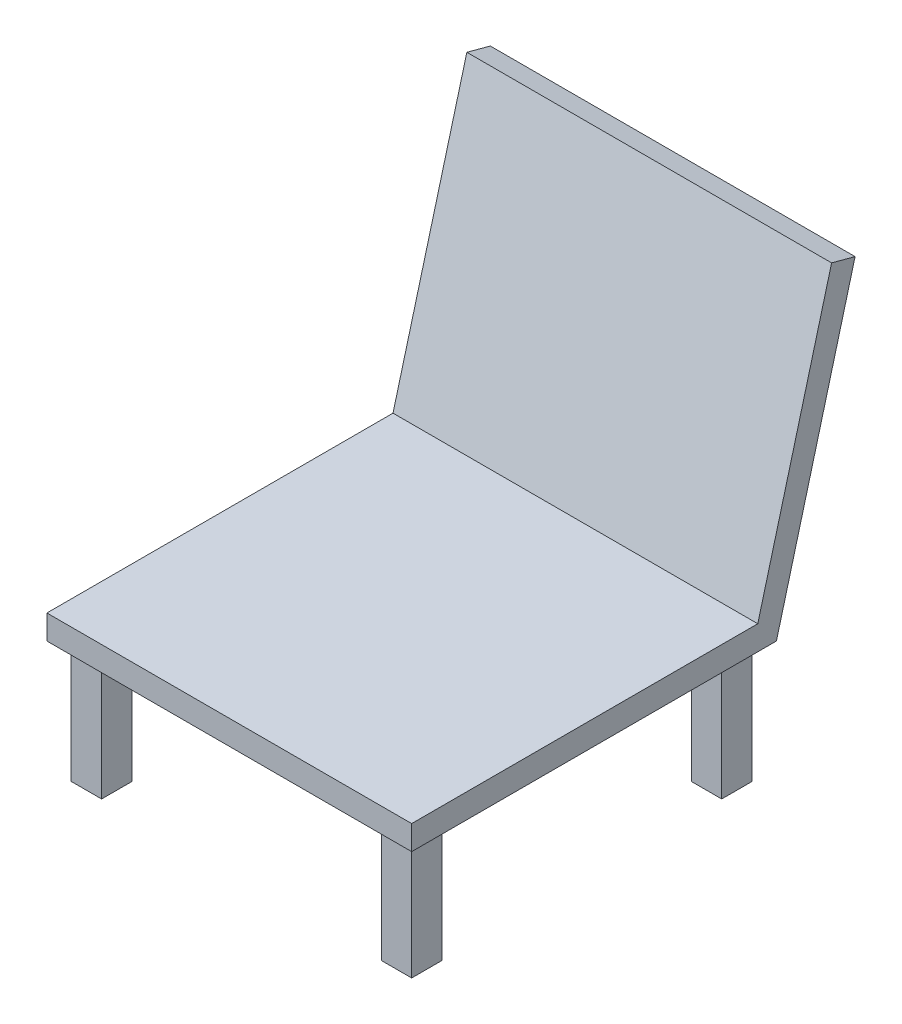
ISO-10303-21;
HEADER;
FILE_DESCRIPTION(('STEP AP214'),'2;1');
FILE_NAME('part.step','',(''),(''),'','','');
FILE_SCHEMA(('AUTOMOTIVE_DESIGN { 1 0 10303 214 1 1 1 1 }'));
ENDSEC;
DATA;
#1=APPLICATION_CONTEXT('core data for automotive mechanical design processes');
#2=APPLICATION_PROTOCOL_DEFINITION('international standard','automotive_design',2000,#1);
#3=PRODUCT_CONTEXT('',#1,'mechanical');
#4=PRODUCT('Part','Part','',(#3));
#5=PRODUCT_RELATED_PRODUCT_CATEGORY('part','',(#4));
#6=PRODUCT_DEFINITION_FORMATION('','',#4);
#7=PRODUCT_DEFINITION_CONTEXT('part definition',#1,'design');
#8=PRODUCT_DEFINITION('design','',#6,#7);
#9=PRODUCT_DEFINITION_SHAPE('','',#8);
#10=(LENGTH_UNIT() NAMED_UNIT(*) SI_UNIT(.MILLI.,.METRE.));
#11=(NAMED_UNIT(*) PLANE_ANGLE_UNIT() SI_UNIT($,.RADIAN.));
#12=(NAMED_UNIT(*) SI_UNIT($,.STERADIAN.) SOLID_ANGLE_UNIT());
#13=UNCERTAINTY_MEASURE_WITH_UNIT(LENGTH_MEASURE(1.E-05),#10,'distance_accuracy_value','');
#14=(GEOMETRIC_REPRESENTATION_CONTEXT(3) GLOBAL_UNCERTAINTY_ASSIGNED_CONTEXT((#13)) GLOBAL_UNIT_ASSIGNED_CONTEXT((#10,
#11,#12)) REPRESENTATION_CONTEXT('',''));
#15=CARTESIAN_POINT('',(0.,0.,0.));
#16=DIRECTION('',(0.,0.,1.));
#17=DIRECTION('',(1.,0.,0.));
#18=AXIS2_PLACEMENT_3D('',#15,#16,#17);
#19=CARTESIAN_POINT('',(300.,336.925610034173,476.395417156042));
#20=DIRECTION('',(0.,1.,0.));
#21=DIRECTION('',(0.,0.,1.));
#22=AXIS2_PLACEMENT_3D('',#19,#20,#21);
#23=PLANE('',#22);
#24=DIRECTION('',(0.,0.,1.));
#25=VECTOR('',#24,1.);
#26=CARTESIAN_POINT('',(290.,336.925610034173,511.395417156042));
#27=LINE('',#26,#25);
#28=CARTESIAN_POINT('',(290.,336.925610034173,486.395417156042));
#29=VERTEX_POINT('',#28);
#30=CARTESIAN_POINT('',(290.,336.925610034173,511.395417156042));
#31=VERTEX_POINT('',#30);
#32=EDGE_CURVE('E207',#29,#31,#27,.T.);
#33=ORIENTED_EDGE('',*,*,#32,.F.);
#34=DIRECTION('',(1.,0.,0.));
#35=VECTOR('',#34,1.);
#36=CARTESIAN_POINT('',(290.,336.925610034173,486.395417156042));
#37=LINE('',#36,#35);
#38=CARTESIAN_POINT('',(265.,336.925610034173,486.395417156042));
#39=VERTEX_POINT('',#38);
#40=EDGE_CURVE('E220',#39,#29,#37,.T.);
#41=ORIENTED_EDGE('',*,*,#40,.F.);
#42=DIRECTION('',(0.,0.,-1.));
#43=VECTOR('',#42,1.);
#44=CARTESIAN_POINT('',(265.,336.925610034173,511.395417156042));
#45=LINE('',#44,#43);
#46=CARTESIAN_POINT('',(265.,336.925610034173,511.395417156042));
#47=VERTEX_POINT('',#46);
#48=EDGE_CURVE('E229',#47,#39,#45,.T.);
#49=ORIENTED_EDGE('',*,*,#48,.F.);
#50=DIRECTION('',(-1.,0.,0.));
#51=VECTOR('',#50,1.);
#52=CARTESIAN_POINT('',(290.,336.925610034173,511.395417156042));
#53=LINE('',#52,#51);
#54=EDGE_CURVE('E210',#31,#47,#53,.T.);
#55=ORIENTED_EDGE('',*,*,#54,.F.);
#56=EDGE_LOOP('',(#33,#41,#49,#55));
#57=FACE_BOUND('',#56,.T.);
#58=DIRECTION('',(0.,0.,1.));
#59=VECTOR('',#58,1.);
#60=CARTESIAN_POINT('',(290.,336.925610034173,741.395417156042));
#61=LINE('',#60,#59);
#62=CARTESIAN_POINT('',(290.,336.925610034173,741.395417156042));
#63=VERTEX_POINT('',#62);
#64=CARTESIAN_POINT('',(290.,336.925610034173,766.395417156042));
#65=VERTEX_POINT('',#64);
#66=EDGE_CURVE('E278',#63,#65,#61,.T.);
#67=ORIENTED_EDGE('',*,*,#66,.F.);
#68=DIRECTION('',(1.,0.,0.));
#69=VECTOR('',#68,1.);
#70=CARTESIAN_POINT('',(290.,336.925610034173,741.395417156042));
#71=LINE('',#70,#69);
#72=CARTESIAN_POINT('',(265.,336.925610034173,741.395417156042));
#73=VERTEX_POINT('',#72);
#74=EDGE_CURVE('E283',#73,#63,#71,.T.);
#75=ORIENTED_EDGE('',*,*,#74,.F.);
#76=DIRECTION('',(0.,0.,-1.));
#77=VECTOR('',#76,1.);
#78=CARTESIAN_POINT('',(265.,336.925610034173,741.395417156042));
#79=LINE('',#78,#77);
#80=CARTESIAN_POINT('',(265.,336.925610034173,766.395417156042));
#81=VERTEX_POINT('',#80);
#82=EDGE_CURVE('E295',#81,#73,#79,.T.);
#83=ORIENTED_EDGE('',*,*,#82,.F.);
#84=DIRECTION('',(-1.,0.,0.));
#85=VECTOR('',#84,1.);
#86=CARTESIAN_POINT('',(290.,336.925610034173,766.395417156042));
#87=LINE('',#86,#85);
#88=EDGE_CURVE('E292',#65,#81,#87,.T.);
#89=ORIENTED_EDGE('',*,*,#88,.F.);
#90=EDGE_LOOP('',(#67,#75,#83,#89));
#91=FACE_BOUND('',#90,.T.);
#92=DIRECTION('',(0.,0.,-1.));
#93=VECTOR('',#92,1.);
#94=CARTESIAN_POINT('',(0.,336.925610034173,476.395417156042));
#95=LINE('',#94,#93);
#96=CARTESIAN_POINT('',(0.,336.925610034173,776.395417156042));
#97=VERTEX_POINT('',#96);
#98=CARTESIAN_POINT('',(0.,336.925610034173,476.395417156042));
#99=VERTEX_POINT('',#98);
#100=EDGE_CURVE('E329',#97,#99,#95,.T.);
#101=ORIENTED_EDGE('',*,*,#100,.T.);
#102=DIRECTION('',(-1.,0.,0.));
#103=VECTOR('',#102,1.);
#104=CARTESIAN_POINT('',(300.,336.925610034173,476.395417156042));
#105=LINE('',#104,#103);
#106=CARTESIAN_POINT('',(300.,336.925610034173,476.395417156042));
#107=VERTEX_POINT('',#106);
#108=EDGE_CURVE('E45',#107,#99,#105,.T.);
#109=ORIENTED_EDGE('',*,*,#108,.F.);
#110=DIRECTION('',(0.,0.,-1.));
#111=VECTOR('',#110,1.);
#112=CARTESIAN_POINT('',(300.,336.925610034173,476.395417156042));
#113=LINE('',#112,#111);
#114=CARTESIAN_POINT('',(300.,336.925610034173,776.395417156042));
#115=VERTEX_POINT('',#114);
#116=EDGE_CURVE('E315',#115,#107,#113,.T.);
#117=ORIENTED_EDGE('',*,*,#116,.F.);
#118=DIRECTION('',(-1.,0.,0.));
#119=VECTOR('',#118,1.);
#120=CARTESIAN_POINT('',(300.,336.925610034173,776.395417156042));
#121=LINE('',#120,#119);
#122=EDGE_CURVE('E11',#115,#97,#121,.T.);
#123=ORIENTED_EDGE('',*,*,#122,.T.);
#124=EDGE_LOOP('',(#101,#109,#117,#123));
#125=FACE_BOUND('',#124,.T.);
#126=DIRECTION('',(0.,0.,-1.));
#127=VECTOR('',#126,1.);
#128=CARTESIAN_POINT('',(10.,336.925610034173,741.395417156042));
#129=LINE('',#128,#127);
#130=CARTESIAN_POINT('',(10.,336.925610034173,766.395417156042));
#131=VERTEX_POINT('',#130);
#132=CARTESIAN_POINT('',(10.,336.925610034173,741.395417156042));
#133=VERTEX_POINT('',#132);
#134=EDGE_CURVE('E245',#131,#133,#129,.T.);
#135=ORIENTED_EDGE('',*,*,#134,.F.);
#136=DIRECTION('',(-1.,0.,0.));
#137=VECTOR('',#136,1.);
#138=CARTESIAN_POINT('',(10.,336.925610034173,766.395417156042));
#139=LINE('',#138,#137);
#140=CARTESIAN_POINT('',(35.,336.925610034173,766.395417156042));
#141=VERTEX_POINT('',#140);
#142=EDGE_CURVE('E250',#141,#131,#139,.T.);
#143=ORIENTED_EDGE('',*,*,#142,.F.);
#144=DIRECTION('',(0.,0.,1.));
#145=VECTOR('',#144,1.);
#146=CARTESIAN_POINT('',(35.,336.925610034173,741.395417156042));
#147=LINE('',#146,#145);
#148=CARTESIAN_POINT('',(35.,336.925610034173,741.395417156042));
#149=VERTEX_POINT('',#148);
#150=EDGE_CURVE('E262',#149,#141,#147,.T.);
#151=ORIENTED_EDGE('',*,*,#150,.F.);
#152=DIRECTION('',(1.,0.,0.));
#153=VECTOR('',#152,1.);
#154=CARTESIAN_POINT('',(10.,336.925610034173,741.395417156042));
#155=LINE('',#154,#153);
#156=EDGE_CURVE('E259',#133,#149,#155,.T.);
#157=ORIENTED_EDGE('',*,*,#156,.F.);
#158=EDGE_LOOP('',(#135,#143,#151,#157));
#159=FACE_BOUND('',#158,.T.);
#160=DIRECTION('',(-1.,0.,0.));
#161=VECTOR('',#160,1.);
#162=CARTESIAN_POINT('',(10.,336.925610034173,511.395417156042));
#163=LINE('',#162,#161);
#164=CARTESIAN_POINT('',(35.,336.925610034173,511.395417156042));
#165=VERTEX_POINT('',#164);
#166=CARTESIAN_POINT('',(10.,336.925610034173,511.395417156042));
#167=VERTEX_POINT('',#166);
#168=EDGE_CURVE('E206',#165,#167,#163,.T.);
#169=ORIENTED_EDGE('',*,*,#168,.F.);
#170=DIRECTION('',(0.,0.,1.));
#171=VECTOR('',#170,1.);
#172=CARTESIAN_POINT('',(35.,336.925610034173,511.395417156042));
#173=LINE('',#172,#171);
#174=CARTESIAN_POINT('',(35.,336.925610034173,486.395417156042));
#175=VERTEX_POINT('',#174);
#176=EDGE_CURVE('E203',#175,#165,#173,.T.);
#177=ORIENTED_EDGE('',*,*,#176,.F.);
#178=DIRECTION('',(1.,0.,0.));
#179=VECTOR('',#178,1.);
#180=CARTESIAN_POINT('',(10.,336.925610034173,486.395417156042));
#181=LINE('',#180,#179);
#182=CARTESIAN_POINT('',(10.,336.925610034173,486.395417156042));
#183=VERTEX_POINT('',#182);
#184=EDGE_CURVE('E57',#183,#175,#181,.T.);
#185=ORIENTED_EDGE('',*,*,#184,.F.);
#186=DIRECTION('',(0.,0.,-1.));
#187=VECTOR('',#186,1.);
#188=CARTESIAN_POINT('',(10.,336.925610034173,511.395417156042));
#189=LINE('',#188,#187);
#190=EDGE_CURVE('E52',#167,#183,#189,.T.);
#191=ORIENTED_EDGE('',*,*,#190,.F.);
#192=EDGE_LOOP('',(#169,#177,#185,#191));
#193=FACE_BOUND('',#192,.T.);
#194=ADVANCED_FACE('F37',(#57,#91,#125,#159,#193),#23,.F.);
#195=CARTESIAN_POINT('',(300.,356.925610034173,776.395417156042));
#196=DIRECTION('',(0.,0.,-1.));
#197=DIRECTION('',(-1.,0.,0.));
#198=AXIS2_PLACEMENT_3D('',#195,#196,#197);
#199=PLANE('',#198);
#200=DIRECTION('',(0.,-1.,0.));
#201=VECTOR('',#200,1.);
#202=CARTESIAN_POINT('',(0.,356.925610034173,776.395417156042));
#203=LINE('',#202,#201);
#204=CARTESIAN_POINT('',(0.,356.925610034173,776.395417156042));
#205=VERTEX_POINT('',#204);
#206=EDGE_CURVE('E311',#205,#97,#203,.T.);
#207=ORIENTED_EDGE('',*,*,#206,.T.);
#208=ORIENTED_EDGE('',*,*,#122,.F.);
#209=DIRECTION('',(0.,-1.,0.));
#210=VECTOR('',#209,1.);
#211=CARTESIAN_POINT('',(300.,356.925610034173,776.395417156042));
#212=LINE('',#211,#210);
#213=CARTESIAN_POINT('',(300.,356.925610034173,776.395417156042));
#214=VERTEX_POINT('',#213);
#215=EDGE_CURVE('E312',#214,#115,#212,.T.);
#216=ORIENTED_EDGE('',*,*,#215,.F.);
#217=DIRECTION('',(-1.,0.,0.));
#218=VECTOR('',#217,1.);
#219=CARTESIAN_POINT('',(300.,356.925610034173,776.395417156042));
#220=LINE('',#219,#218);
#221=EDGE_CURVE('E326',#214,#205,#220,.T.);
#222=ORIENTED_EDGE('',*,*,#221,.T.);
#223=EDGE_LOOP('',(#207,#208,#216,#222));
#224=FACE_BOUND('',#223,.T.);
#225=ADVANCED_FACE('F39',(#224),#199,.F.);
#226=CARTESIAN_POINT('',(300.,336.925610034173,476.395417156042));
#227=DIRECTION('',(0.,0.258819045102524,0.965925826289067));
#228=DIRECTION('',(0.,-0.965925826289067,0.258819045102524));
#229=AXIS2_PLACEMENT_3D('',#226,#227,#228);
#230=PLANE('',#229);
#231=DIRECTION('',(0.,0.965925826289067,-0.258819045102524));
#232=VECTOR('',#231,1.);
#233=CARTESIAN_POINT('',(0.,336.925610034173,476.395417156042));
#234=LINE('',#233,#232);
#235=CARTESIAN_POINT('',(0.,578.40706660644,411.690655880411));
#236=VERTEX_POINT('',#235);
#237=EDGE_CURVE('E331',#99,#236,#234,.T.);
#238=ORIENTED_EDGE('',*,*,#237,.T.);
#239=DIRECTION('',(-1.,0.,0.));
#240=VECTOR('',#239,1.);
#241=CARTESIAN_POINT('',(300.,578.40706660644,411.690655880411));
#242=LINE('',#241,#240);
#243=CARTESIAN_POINT('',(300.,578.40706660644,411.690655880411));
#244=VERTEX_POINT('',#243);
#245=EDGE_CURVE('E346',#244,#236,#242,.T.);
#246=ORIENTED_EDGE('',*,*,#245,.F.);
#247=DIRECTION('',(0.,0.965925826289067,-0.258819045102524));
#248=VECTOR('',#247,1.);
#249=CARTESIAN_POINT('',(300.,336.925610034173,476.395417156042));
#250=LINE('',#249,#248);
#251=EDGE_CURVE('E318',#107,#244,#250,.T.);
#252=ORIENTED_EDGE('',*,*,#251,.F.);
#253=ORIENTED_EDGE('',*,*,#108,.T.);
#254=EDGE_LOOP('',(#238,#246,#252,#253));
#255=FACE_BOUND('',#254,.T.);
#256=ADVANCED_FACE('F353',(#255),#230,.F.);
#257=CARTESIAN_POINT('',(300.,578.40706660644,411.690655880411));
#258=DIRECTION('',(0.,-0.965925826289068,0.258819045102522));
#259=DIRECTION('',(0.,-0.258819045102522,-0.965925826289068));
#260=AXIS2_PLACEMENT_3D('',#257,#258,#259);
#261=PLANE('',#260);
#262=DIRECTION('',(0.,0.258819045102522,0.965925826289068));
#263=VECTOR('',#262,1.);
#264=CARTESIAN_POINT('',(0.,578.40706660644,411.690655880411));
#265=LINE('',#264,#263);
#266=CARTESIAN_POINT('',(0.,583.58344750849,431.009172406192));
#267=VERTEX_POINT('',#266);
#268=EDGE_CURVE('E333',#236,#267,#265,.T.);
#269=ORIENTED_EDGE('',*,*,#268,.T.);
#270=DIRECTION('',(-1.,0.,0.));
#271=VECTOR('',#270,1.);
#272=CARTESIAN_POINT('',(300.,583.58344750849,431.009172406192));
#273=LINE('',#272,#271);
#274=CARTESIAN_POINT('',(300.,583.58344750849,431.009172406192));
#275=VERTEX_POINT('',#274);
#276=EDGE_CURVE('E343',#275,#267,#273,.T.);
#277=ORIENTED_EDGE('',*,*,#276,.F.);
#278=DIRECTION('',(0.,0.258819045102522,0.965925826289068));
#279=VECTOR('',#278,1.);
#280=CARTESIAN_POINT('',(300.,578.40706660644,411.690655880411));
#281=LINE('',#280,#279);
#282=EDGE_CURVE('E320',#244,#275,#281,.T.);
#283=ORIENTED_EDGE('',*,*,#282,.F.);
#284=ORIENTED_EDGE('',*,*,#245,.T.);
#285=EDGE_LOOP('',(#269,#277,#283,#284));
#286=FACE_BOUND('',#285,.T.);
#287=ADVANCED_FACE('F364',(#286),#261,.F.);
#288=CARTESIAN_POINT('',(300.,356.925610034173,491.741956915621));
#289=DIRECTION('',(0.,-0.258819045102525,-0.965925826289067));
#290=DIRECTION('',(0.,0.965925826289067,-0.258819045102525));
#291=AXIS2_PLACEMENT_3D('',#288,#289,#290);
#292=PLANE('',#291);
#293=DIRECTION('',(0.,-0.965925826289067,0.258819045102525));
#294=VECTOR('',#293,1.);
#295=CARTESIAN_POINT('',(0.,356.925610034173,491.741956915621));
#296=LINE('',#295,#294);
#297=CARTESIAN_POINT('',(0.,356.925610034173,491.741956915621));
#298=VERTEX_POINT('',#297);
#299=EDGE_CURVE('E335',#267,#298,#296,.T.);
#300=ORIENTED_EDGE('',*,*,#299,.T.);
#301=DIRECTION('',(-1.,0.,0.));
#302=VECTOR('',#301,1.);
#303=CARTESIAN_POINT('',(300.,356.925610034173,491.741956915621));
#304=LINE('',#303,#302);
#305=CARTESIAN_POINT('',(300.,356.925610034173,491.741956915621));
#306=VERTEX_POINT('',#305);
#307=EDGE_CURVE('E340',#306,#298,#304,.T.);
#308=ORIENTED_EDGE('',*,*,#307,.F.);
#309=DIRECTION('',(0.,-0.965925826289067,0.258819045102525));
#310=VECTOR('',#309,1.);
#311=CARTESIAN_POINT('',(300.,356.925610034173,491.741956915621));
#312=LINE('',#311,#310);
#313=EDGE_CURVE('E322',#275,#306,#312,.T.);
#314=ORIENTED_EDGE('',*,*,#313,.F.);
#315=ORIENTED_EDGE('',*,*,#276,.T.);
#316=EDGE_LOOP('',(#300,#308,#314,#315));
#317=FACE_BOUND('',#316,.T.);
#318=ADVANCED_FACE('F368',(#317),#292,.F.);
#319=CARTESIAN_POINT('',(300.,356.925610034173,491.741956915621));
#320=DIRECTION('',(0.,-1.,0.));
#321=DIRECTION('',(0.,0.,-1.));
#322=AXIS2_PLACEMENT_3D('',#319,#320,#321);
#323=PLANE('',#322);
#324=DIRECTION('',(0.,0.,1.));
#325=VECTOR('',#324,1.);
#326=CARTESIAN_POINT('',(0.,356.925610034173,491.741956915621));
#327=LINE('',#326,#325);
#328=EDGE_CURVE('E316',#298,#205,#327,.T.);
#329=ORIENTED_EDGE('',*,*,#328,.T.);
#330=ORIENTED_EDGE('',*,*,#221,.F.);
#331=DIRECTION('',(0.,0.,1.));
#332=VECTOR('',#331,1.);
#333=CARTESIAN_POINT('',(300.,356.925610034173,491.741956915621));
#334=LINE('',#333,#332);
#335=EDGE_CURVE('E324',#306,#214,#334,.T.);
#336=ORIENTED_EDGE('',*,*,#335,.F.);
#337=ORIENTED_EDGE('',*,*,#307,.T.);
#338=EDGE_LOOP('',(#329,#330,#336,#337));
#339=FACE_BOUND('',#338,.T.);
#340=ADVANCED_FACE('F379',(#339),#323,.F.);
#341=CARTESIAN_POINT('',(300.,0.,0.));
#342=DIRECTION('',(-1.,0.,0.));
#343=DIRECTION('',(0.,0.,1.));
#344=AXIS2_PLACEMENT_3D('',#341,#342,#343);
#345=PLANE('',#344);
#346=ORIENTED_EDGE('',*,*,#215,.T.);
#347=ORIENTED_EDGE('',*,*,#116,.T.);
#348=ORIENTED_EDGE('',*,*,#251,.T.);
#349=ORIENTED_EDGE('',*,*,#282,.T.);
#350=ORIENTED_EDGE('',*,*,#313,.T.);
#351=ORIENTED_EDGE('',*,*,#335,.T.);
#352=EDGE_LOOP('',(#346,#347,#348,#349,#350,#351));
#353=FACE_BOUND('',#352,.T.);
#354=ADVANCED_FACE('F372',(#353),#345,.F.);
#355=CARTESIAN_POINT('',(0.,0.,0.));
#356=DIRECTION('',(-1.,0.,0.));
#357=DIRECTION('',(0.,0.,1.));
#358=AXIS2_PLACEMENT_3D('',#355,#356,#357);
#359=PLANE('',#358);
#360=ORIENTED_EDGE('',*,*,#206,.F.);
#361=ORIENTED_EDGE('',*,*,#328,.F.);
#362=ORIENTED_EDGE('',*,*,#299,.F.);
#363=ORIENTED_EDGE('',*,*,#268,.F.);
#364=ORIENTED_EDGE('',*,*,#237,.F.);
#365=ORIENTED_EDGE('',*,*,#100,.F.);
#366=EDGE_LOOP('',(#360,#361,#362,#363,#364,#365));
#367=FACE_BOUND('',#366,.T.);
#368=ADVANCED_FACE('F359',(#367),#359,.T.);
#369=CARTESIAN_POINT('',(290.,236.925610034173,741.395417156042));
#370=DIRECTION('',(-1.,0.,0.));
#371=DIRECTION('',(0.,0.,1.));
#372=AXIS2_PLACEMENT_3D('',#369,#370,#371);
#373=PLANE('',#372);
#374=ORIENTED_EDGE('',*,*,#66,.T.);
#375=DIRECTION('',(0.,1.,0.));
#376=VECTOR('',#375,1.);
#377=CARTESIAN_POINT('',(290.,236.925610034173,766.395417156042));
#378=LINE('',#377,#376);
#379=CARTESIAN_POINT('',(290.,236.925610034173,766.395417156042));
#380=VERTEX_POINT('',#379);
#381=EDGE_CURVE('E308',#380,#65,#378,.T.);
#382=ORIENTED_EDGE('',*,*,#381,.F.);
#383=DIRECTION('',(0.,0.,1.));
#384=VECTOR('',#383,1.);
#385=CARTESIAN_POINT('',(290.,236.925610034173,741.395417156042));
#386=LINE('',#385,#384);
#387=CARTESIAN_POINT('',(290.,236.925610034173,741.395417156042));
#388=VERTEX_POINT('',#387);
#389=EDGE_CURVE('E279',#388,#380,#386,.T.);
#390=ORIENTED_EDGE('',*,*,#389,.F.);
#391=DIRECTION('',(0.,1.,0.));
#392=VECTOR('',#391,1.);
#393=CARTESIAN_POINT('',(290.,236.925610034173,741.395417156042));
#394=LINE('',#393,#392);
#395=EDGE_CURVE('E289',#388,#63,#394,.T.);
#396=ORIENTED_EDGE('',*,*,#395,.T.);
#397=EDGE_LOOP('',(#374,#382,#390,#396));
#398=FACE_BOUND('',#397,.T.);
#399=ADVANCED_FACE('F426',(#398),#373,.F.);
#400=CARTESIAN_POINT('',(290.,236.925610034173,766.395417156042));
#401=DIRECTION('',(0.,0.,-1.));
#402=DIRECTION('',(-1.,0.,0.));
#403=AXIS2_PLACEMENT_3D('',#400,#401,#402);
#404=PLANE('',#403);
#405=ORIENTED_EDGE('',*,*,#88,.T.);
#406=DIRECTION('',(0.,1.,0.));
#407=VECTOR('',#406,1.);
#408=CARTESIAN_POINT('',(265.,236.925610034173,766.395417156042));
#409=LINE('',#408,#407);
#410=CARTESIAN_POINT('',(265.,236.925610034173,766.395417156042));
#411=VERTEX_POINT('',#410);
#412=EDGE_CURVE('E305',#411,#81,#409,.T.);
#413=ORIENTED_EDGE('',*,*,#412,.F.);
#414=DIRECTION('',(-1.,0.,0.));
#415=VECTOR('',#414,1.);
#416=CARTESIAN_POINT('',(290.,236.925610034173,766.395417156042));
#417=LINE('',#416,#415);
#418=EDGE_CURVE('E282',#380,#411,#417,.T.);
#419=ORIENTED_EDGE('',*,*,#418,.F.);
#420=ORIENTED_EDGE('',*,*,#381,.T.);
#421=EDGE_LOOP('',(#405,#413,#419,#420));
#422=FACE_BOUND('',#421,.T.);
#423=ADVANCED_FACE('F438',(#422),#404,.F.);
#424=CARTESIAN_POINT('',(265.,236.925610034173,741.395417156042));
#425=DIRECTION('',(1.,0.,0.));
#426=DIRECTION('',(0.,0.,-1.));
#427=AXIS2_PLACEMENT_3D('',#424,#425,#426);
#428=PLANE('',#427);
#429=ORIENTED_EDGE('',*,*,#82,.T.);
#430=DIRECTION('',(0.,1.,0.));
#431=VECTOR('',#430,1.);
#432=CARTESIAN_POINT('',(265.,236.925610034173,741.395417156042));
#433=LINE('',#432,#431);
#434=CARTESIAN_POINT('',(265.,236.925610034173,741.395417156042));
#435=VERTEX_POINT('',#434);
#436=EDGE_CURVE('E302',#435,#73,#433,.T.);
#437=ORIENTED_EDGE('',*,*,#436,.F.);
#438=DIRECTION('',(0.,0.,-1.));
#439=VECTOR('',#438,1.);
#440=CARTESIAN_POINT('',(265.,236.925610034173,741.395417156042));
#441=LINE('',#440,#439);
#442=EDGE_CURVE('E285',#411,#435,#441,.T.);
#443=ORIENTED_EDGE('',*,*,#442,.F.);
#444=ORIENTED_EDGE('',*,*,#412,.T.);
#445=EDGE_LOOP('',(#429,#437,#443,#444));
#446=FACE_BOUND('',#445,.T.);
#447=ADVANCED_FACE('F445',(#446),#428,.F.);
#448=CARTESIAN_POINT('',(290.,236.925610034173,741.395417156042));
#449=DIRECTION('',(0.,0.,1.));
#450=DIRECTION('',(1.,0.,0.));
#451=AXIS2_PLACEMENT_3D('',#448,#449,#450);
#452=PLANE('',#451);
#453=ORIENTED_EDGE('',*,*,#74,.T.);
#454=ORIENTED_EDGE('',*,*,#395,.F.);
#455=DIRECTION('',(1.,0.,0.));
#456=VECTOR('',#455,1.);
#457=CARTESIAN_POINT('',(290.,236.925610034173,741.395417156042));
#458=LINE('',#457,#456);
#459=EDGE_CURVE('E287',#435,#388,#458,.T.);
#460=ORIENTED_EDGE('',*,*,#459,.F.);
#461=ORIENTED_EDGE('',*,*,#436,.T.);
#462=EDGE_LOOP('',(#453,#454,#460,#461));
#463=FACE_BOUND('',#462,.T.);
#464=ADVANCED_FACE('F453',(#463),#452,.F.);
#465=CARTESIAN_POINT('',(0.,236.925610034173,0.));
#466=DIRECTION('',(0.,-1.,0.));
#467=DIRECTION('',(0.,0.,-1.));
#468=AXIS2_PLACEMENT_3D('',#465,#466,#467);
#469=PLANE('',#468);
#470=ORIENTED_EDGE('',*,*,#389,.T.);
#471=ORIENTED_EDGE('',*,*,#418,.T.);
#472=ORIENTED_EDGE('',*,*,#442,.T.);
#473=ORIENTED_EDGE('',*,*,#459,.T.);
#474=EDGE_LOOP('',(#470,#471,#472,#473));
#475=FACE_BOUND('',#474,.T.);
#476=ADVANCED_FACE('F461',(#475),#469,.T.);
#477=CARTESIAN_POINT('',(10.,236.925610034173,741.395417156042));
#478=DIRECTION('',(1.,0.,0.));
#479=DIRECTION('',(0.,0.,-1.));
#480=AXIS2_PLACEMENT_3D('',#477,#478,#479);
#481=PLANE('',#480);
#482=ORIENTED_EDGE('',*,*,#134,.T.);
#483=DIRECTION('',(0.,1.,0.));
#484=VECTOR('',#483,1.);
#485=CARTESIAN_POINT('',(10.,236.925610034173,741.395417156042));
#486=LINE('',#485,#484);
#487=CARTESIAN_POINT('',(10.,236.925610034173,741.395417156042));
#488=VERTEX_POINT('',#487);
#489=EDGE_CURVE('E275',#488,#133,#486,.T.);
#490=ORIENTED_EDGE('',*,*,#489,.F.);
#491=DIRECTION('',(0.,0.,-1.));
#492=VECTOR('',#491,1.);
#493=CARTESIAN_POINT('',(10.,236.925610034173,741.395417156042));
#494=LINE('',#493,#492);
#495=CARTESIAN_POINT('',(10.,236.925610034173,766.395417156042));
#496=VERTEX_POINT('',#495);
#497=EDGE_CURVE('E246',#496,#488,#494,.T.);
#498=ORIENTED_EDGE('',*,*,#497,.F.);
#499=DIRECTION('',(0.,1.,0.));
#500=VECTOR('',#499,1.);
#501=CARTESIAN_POINT('',(10.,236.925610034173,766.395417156042));
#502=LINE('',#501,#500);
#503=EDGE_CURVE('E256',#496,#131,#502,.T.);
#504=ORIENTED_EDGE('',*,*,#503,.T.);
#505=EDGE_LOOP('',(#482,#490,#498,#504));
#506=FACE_BOUND('',#505,.T.);
#507=ADVANCED_FACE('F469',(#506),#481,.F.);
#508=CARTESIAN_POINT('',(10.,236.925610034173,741.395417156042));
#509=DIRECTION('',(0.,0.,1.));
#510=DIRECTION('',(1.,0.,0.));
#511=AXIS2_PLACEMENT_3D('',#508,#509,#510);
#512=PLANE('',#511);
#513=ORIENTED_EDGE('',*,*,#156,.T.);
#514=DIRECTION('',(0.,1.,0.));
#515=VECTOR('',#514,1.);
#516=CARTESIAN_POINT('',(35.,236.925610034173,741.395417156042));
#517=LINE('',#516,#515);
#518=CARTESIAN_POINT('',(35.,236.925610034173,741.395417156042));
#519=VERTEX_POINT('',#518);
#520=EDGE_CURVE('E272',#519,#149,#517,.T.);
#521=ORIENTED_EDGE('',*,*,#520,.F.);
#522=DIRECTION('',(1.,0.,0.));
#523=VECTOR('',#522,1.);
#524=CARTESIAN_POINT('',(10.,236.925610034173,741.395417156042));
#525=LINE('',#524,#523);
#526=EDGE_CURVE('E249',#488,#519,#525,.T.);
#527=ORIENTED_EDGE('',*,*,#526,.F.);
#528=ORIENTED_EDGE('',*,*,#489,.T.);
#529=EDGE_LOOP('',(#513,#521,#527,#528));
#530=FACE_BOUND('',#529,.T.);
#531=ADVANCED_FACE('F477',(#530),#512,.F.);
#532=CARTESIAN_POINT('',(35.,236.925610034173,741.395417156042));
#533=DIRECTION('',(-1.,0.,0.));
#534=DIRECTION('',(0.,0.,1.));
#535=AXIS2_PLACEMENT_3D('',#532,#533,#534);
#536=PLANE('',#535);
#537=ORIENTED_EDGE('',*,*,#150,.T.);
#538=DIRECTION('',(0.,1.,0.));
#539=VECTOR('',#538,1.);
#540=CARTESIAN_POINT('',(35.,236.925610034173,766.395417156042));
#541=LINE('',#540,#539);
#542=CARTESIAN_POINT('',(35.,236.925610034173,766.395417156042));
#543=VERTEX_POINT('',#542);
#544=EDGE_CURVE('E269',#543,#141,#541,.T.);
#545=ORIENTED_EDGE('',*,*,#544,.F.);
#546=DIRECTION('',(0.,0.,1.));
#547=VECTOR('',#546,1.);
#548=CARTESIAN_POINT('',(35.,236.925610034173,741.395417156042));
#549=LINE('',#548,#547);
#550=EDGE_CURVE('E252',#519,#543,#549,.T.);
#551=ORIENTED_EDGE('',*,*,#550,.F.);
#552=ORIENTED_EDGE('',*,*,#520,.T.);
#553=EDGE_LOOP('',(#537,#545,#551,#552));
#554=FACE_BOUND('',#553,.T.);
#555=ADVANCED_FACE('F485',(#554),#536,.F.);
#556=CARTESIAN_POINT('',(10.,236.925610034173,766.395417156042));
#557=DIRECTION('',(0.,0.,-1.));
#558=DIRECTION('',(-1.,0.,0.));
#559=AXIS2_PLACEMENT_3D('',#556,#557,#558);
#560=PLANE('',#559);
#561=ORIENTED_EDGE('',*,*,#142,.T.);
#562=ORIENTED_EDGE('',*,*,#503,.F.);
#563=DIRECTION('',(-1.,0.,0.));
#564=VECTOR('',#563,1.);
#565=CARTESIAN_POINT('',(10.,236.925610034173,766.395417156042));
#566=LINE('',#565,#564);
#567=EDGE_CURVE('E254',#543,#496,#566,.T.);
#568=ORIENTED_EDGE('',*,*,#567,.F.);
#569=ORIENTED_EDGE('',*,*,#544,.T.);
#570=EDGE_LOOP('',(#561,#562,#568,#569));
#571=FACE_BOUND('',#570,.T.);
#572=ADVANCED_FACE('F493',(#571),#560,.F.);
#573=CARTESIAN_POINT('',(0.,236.925610034173,0.));
#574=DIRECTION('',(0.,1.,0.));
#575=DIRECTION('',(0.,0.,1.));
#576=AXIS2_PLACEMENT_3D('',#573,#574,#575);
#577=PLANE('',#576);
#578=ORIENTED_EDGE('',*,*,#497,.T.);
#579=ORIENTED_EDGE('',*,*,#526,.T.);
#580=ORIENTED_EDGE('',*,*,#550,.T.);
#581=ORIENTED_EDGE('',*,*,#567,.T.);
#582=EDGE_LOOP('',(#578,#579,#580,#581));
#583=FACE_BOUND('',#582,.T.);
#584=ADVANCED_FACE('F501',(#583),#577,.F.);
#585=CARTESIAN_POINT('',(290.,236.925610034173,511.395417156042));
#586=DIRECTION('',(-1.,0.,0.));
#587=DIRECTION('',(0.,0.,1.));
#588=AXIS2_PLACEMENT_3D('',#585,#586,#587);
#589=PLANE('',#588);
#590=ORIENTED_EDGE('',*,*,#32,.T.);
#591=DIRECTION('',(0.,1.,0.));
#592=VECTOR('',#591,1.);
#593=CARTESIAN_POINT('',(290.,236.925610034173,511.395417156042));
#594=LINE('',#593,#592);
#595=CARTESIAN_POINT('',(290.,236.925610034173,511.395417156042));
#596=VERTEX_POINT('',#595);
#597=EDGE_CURVE('E242',#596,#31,#594,.T.);
#598=ORIENTED_EDGE('',*,*,#597,.F.);
#599=DIRECTION('',(0.,0.,1.));
#600=VECTOR('',#599,1.);
#601=CARTESIAN_POINT('',(290.,236.925610034173,511.395417156042));
#602=LINE('',#601,#600);
#603=CARTESIAN_POINT('',(290.,236.925610034173,486.395417156042));
#604=VERTEX_POINT('',#603);
#605=EDGE_CURVE('E216',#604,#596,#602,.T.);
#606=ORIENTED_EDGE('',*,*,#605,.F.);
#607=DIRECTION('',(0.,1.,0.));
#608=VECTOR('',#607,1.);
#609=CARTESIAN_POINT('',(290.,236.925610034173,486.395417156042));
#610=LINE('',#609,#608);
#611=EDGE_CURVE('E225',#604,#29,#610,.T.);
#612=ORIENTED_EDGE('',*,*,#611,.T.);
#613=EDGE_LOOP('',(#590,#598,#606,#612));
#614=FACE_BOUND('',#613,.T.);
#615=ADVANCED_FACE('F509',(#614),#589,.F.);
#616=CARTESIAN_POINT('',(290.,236.925610034173,511.395417156042));
#617=DIRECTION('',(0.,0.,-1.));
#618=DIRECTION('',(-1.,0.,0.));
#619=AXIS2_PLACEMENT_3D('',#616,#617,#618);
#620=PLANE('',#619);
#621=ORIENTED_EDGE('',*,*,#54,.T.);
#622=DIRECTION('',(0.,1.,0.));
#623=VECTOR('',#622,1.);
#624=CARTESIAN_POINT('',(265.,236.925610034173,511.395417156042));
#625=LINE('',#624,#623);
#626=CARTESIAN_POINT('',(265.,236.925610034173,511.395417156042));
#627=VERTEX_POINT('',#626);
#628=EDGE_CURVE('E239',#627,#47,#625,.T.);
#629=ORIENTED_EDGE('',*,*,#628,.F.);
#630=DIRECTION('',(-1.,0.,0.));
#631=VECTOR('',#630,1.);
#632=CARTESIAN_POINT('',(290.,236.925610034173,511.395417156042));
#633=LINE('',#632,#631);
#634=EDGE_CURVE('E219',#596,#627,#633,.T.);
#635=ORIENTED_EDGE('',*,*,#634,.F.);
#636=ORIENTED_EDGE('',*,*,#597,.T.);
#637=EDGE_LOOP('',(#621,#629,#635,#636));
#638=FACE_BOUND('',#637,.T.);
#639=ADVANCED_FACE('F517',(#638),#620,.F.);
#640=CARTESIAN_POINT('',(265.,236.925610034173,511.395417156042));
#641=DIRECTION('',(1.,0.,0.));
#642=DIRECTION('',(0.,0.,-1.));
#643=AXIS2_PLACEMENT_3D('',#640,#641,#642);
#644=PLANE('',#643);
#645=ORIENTED_EDGE('',*,*,#48,.T.);
#646=DIRECTION('',(0.,1.,0.));
#647=VECTOR('',#646,1.);
#648=CARTESIAN_POINT('',(265.,236.925610034173,486.395417156042));
#649=LINE('',#648,#647);
#650=CARTESIAN_POINT('',(265.,236.925610034173,486.395417156042));
#651=VERTEX_POINT('',#650);
#652=EDGE_CURVE('E236',#651,#39,#649,.T.);
#653=ORIENTED_EDGE('',*,*,#652,.F.);
#654=DIRECTION('',(0.,0.,-1.));
#655=VECTOR('',#654,1.);
#656=CARTESIAN_POINT('',(265.,236.925610034173,511.395417156042));
#657=LINE('',#656,#655);
#658=EDGE_CURVE('E222',#627,#651,#657,.T.);
#659=ORIENTED_EDGE('',*,*,#658,.F.);
#660=ORIENTED_EDGE('',*,*,#628,.T.);
#661=EDGE_LOOP('',(#645,#653,#659,#660));
#662=FACE_BOUND('',#661,.T.);
#663=ADVANCED_FACE('F525',(#662),#644,.F.);
#664=CARTESIAN_POINT('',(290.,236.925610034173,486.395417156042));
#665=DIRECTION('',(0.,0.,1.));
#666=DIRECTION('',(1.,0.,0.));
#667=AXIS2_PLACEMENT_3D('',#664,#665,#666);
#668=PLANE('',#667);
#669=ORIENTED_EDGE('',*,*,#40,.T.);
#670=ORIENTED_EDGE('',*,*,#611,.F.);
#671=DIRECTION('',(1.,0.,0.));
#672=VECTOR('',#671,1.);
#673=CARTESIAN_POINT('',(290.,236.925610034173,486.395417156042));
#674=LINE('',#673,#672);
#675=EDGE_CURVE('E224',#651,#604,#674,.T.);
#676=ORIENTED_EDGE('',*,*,#675,.F.);
#677=ORIENTED_EDGE('',*,*,#652,.T.);
#678=EDGE_LOOP('',(#669,#670,#676,#677));
#679=FACE_BOUND('',#678,.T.);
#680=ADVANCED_FACE('F533',(#679),#668,.F.);
#681=CARTESIAN_POINT('',(0.,236.925610034173,0.));
#682=DIRECTION('',(0.,1.,0.));
#683=DIRECTION('',(0.,0.,1.));
#684=AXIS2_PLACEMENT_3D('',#681,#682,#683);
#685=PLANE('',#684);
#686=ORIENTED_EDGE('',*,*,#605,.T.);
#687=ORIENTED_EDGE('',*,*,#634,.T.);
#688=ORIENTED_EDGE('',*,*,#658,.T.);
#689=ORIENTED_EDGE('',*,*,#675,.T.);
#690=EDGE_LOOP('',(#686,#687,#688,#689));
#691=FACE_BOUND('',#690,.T.);
#692=ADVANCED_FACE('F541',(#691),#685,.F.);
#693=CARTESIAN_POINT('',(10.,236.925610034173,511.395417156042));
#694=DIRECTION('',(0.,0.,-1.));
#695=DIRECTION('',(-1.,0.,0.));
#696=AXIS2_PLACEMENT_3D('',#693,#694,#695);
#697=PLANE('',#696);
#698=ORIENTED_EDGE('',*,*,#168,.T.);
#699=DIRECTION('',(0.,1.,0.));
#700=VECTOR('',#699,1.);
#701=CARTESIAN_POINT('',(10.,236.925610034173,511.395417156042));
#702=LINE('',#701,#700);
#703=CARTESIAN_POINT('',(10.,236.925610034173,511.395417156042));
#704=VERTEX_POINT('',#703);
#705=EDGE_CURVE('E187',#704,#167,#702,.T.);
#706=ORIENTED_EDGE('',*,*,#705,.F.);
#707=DIRECTION('',(-1.,0.,0.));
#708=VECTOR('',#707,1.);
#709=CARTESIAN_POINT('',(10.,236.925610034173,511.395417156042));
#710=LINE('',#709,#708);
#711=CARTESIAN_POINT('',(35.,236.925610034173,511.395417156042));
#712=VERTEX_POINT('',#711);
#713=EDGE_CURVE('E194',#712,#704,#710,.T.);
#714=ORIENTED_EDGE('',*,*,#713,.F.);
#715=DIRECTION('',(0.,1.,0.));
#716=VECTOR('',#715,1.);
#717=CARTESIAN_POINT('',(35.,236.925610034173,511.395417156042));
#718=LINE('',#717,#716);
#719=EDGE_CURVE('E628',#712,#165,#718,.T.);
#720=ORIENTED_EDGE('',*,*,#719,.T.);
#721=EDGE_LOOP('',(#698,#706,#714,#720));
#722=FACE_BOUND('',#721,.T.);
#723=ADVANCED_FACE('F205',(#722),#697,.F.);
#724=CARTESIAN_POINT('',(10.,236.925610034173,511.395417156042));
#725=DIRECTION('',(1.,0.,0.));
#726=DIRECTION('',(0.,0.,-1.));
#727=AXIS2_PLACEMENT_3D('',#724,#725,#726);
#728=PLANE('',#727);
#729=ORIENTED_EDGE('',*,*,#190,.T.);
#730=DIRECTION('',(0.,1.,0.));
#731=VECTOR('',#730,1.);
#732=CARTESIAN_POINT('',(10.,236.925610034173,486.395417156042));
#733=LINE('',#732,#731);
#734=CARTESIAN_POINT('',(10.,236.925610034173,486.395417156042));
#735=VERTEX_POINT('',#734);
#736=EDGE_CURVE('E190',#735,#183,#733,.T.);
#737=ORIENTED_EDGE('',*,*,#736,.F.);
#738=DIRECTION('',(0.,0.,-1.));
#739=VECTOR('',#738,1.);
#740=CARTESIAN_POINT('',(10.,236.925610034173,511.395417156042));
#741=LINE('',#740,#739);
#742=EDGE_CURVE('E183',#704,#735,#741,.T.);
#743=ORIENTED_EDGE('',*,*,#742,.F.);
#744=ORIENTED_EDGE('',*,*,#705,.T.);
#745=EDGE_LOOP('',(#729,#737,#743,#744));
#746=FACE_BOUND('',#745,.T.);
#747=ADVANCED_FACE('F185',(#746),#728,.F.);
#748=CARTESIAN_POINT('',(10.,236.925610034173,486.395417156042));
#749=DIRECTION('',(0.,0.,1.));
#750=DIRECTION('',(1.,0.,0.));
#751=AXIS2_PLACEMENT_3D('',#748,#749,#750);
#752=PLANE('',#751);
#753=ORIENTED_EDGE('',*,*,#184,.T.);
#754=DIRECTION('',(0.,1.,0.));
#755=VECTOR('',#754,1.);
#756=CARTESIAN_POINT('',(35.,236.925610034173,486.395417156042));
#757=LINE('',#756,#755);
#758=CARTESIAN_POINT('',(35.,236.925610034173,486.395417156042));
#759=VERTEX_POINT('',#758);
#760=EDGE_CURVE('E212',#759,#175,#757,.T.);
#761=ORIENTED_EDGE('',*,*,#760,.F.);
#762=DIRECTION('',(1.,0.,0.));
#763=VECTOR('',#762,1.);
#764=CARTESIAN_POINT('',(10.,236.925610034173,486.395417156042));
#765=LINE('',#764,#763);
#766=EDGE_CURVE('E193',#735,#759,#765,.T.);
#767=ORIENTED_EDGE('',*,*,#766,.F.);
#768=ORIENTED_EDGE('',*,*,#736,.T.);
#769=EDGE_LOOP('',(#753,#761,#767,#768));
#770=FACE_BOUND('',#769,.T.);
#771=ADVANCED_FACE('F562',(#770),#752,.F.);
#772=CARTESIAN_POINT('',(35.,236.925610034173,511.395417156042));
#773=DIRECTION('',(-1.,0.,0.));
#774=DIRECTION('',(0.,0.,1.));
#775=AXIS2_PLACEMENT_3D('',#772,#773,#774);
#776=PLANE('',#775);
#777=ORIENTED_EDGE('',*,*,#176,.T.);
#778=ORIENTED_EDGE('',*,*,#719,.F.);
#779=DIRECTION('',(0.,0.,1.));
#780=VECTOR('',#779,1.);
#781=CARTESIAN_POINT('',(35.,236.925610034173,511.395417156042));
#782=LINE('',#781,#780);
#783=EDGE_CURVE('E199',#759,#712,#782,.T.);
#784=ORIENTED_EDGE('',*,*,#783,.F.);
#785=ORIENTED_EDGE('',*,*,#760,.T.);
#786=EDGE_LOOP('',(#777,#778,#784,#785));
#787=FACE_BOUND('',#786,.T.);
#788=ADVANCED_FACE('F569',(#787),#776,.F.);
#789=CARTESIAN_POINT('',(0.,236.925610034173,0.));
#790=DIRECTION('',(0.,1.,0.));
#791=DIRECTION('',(0.,0.,1.));
#792=AXIS2_PLACEMENT_3D('',#789,#790,#791);
#793=PLANE('',#792);
#794=ORIENTED_EDGE('',*,*,#713,.T.);
#795=ORIENTED_EDGE('',*,*,#742,.T.);
#796=ORIENTED_EDGE('',*,*,#766,.T.);
#797=ORIENTED_EDGE('',*,*,#783,.T.);
#798=EDGE_LOOP('',(#794,#795,#796,#797));
#799=FACE_BOUND('',#798,.T.);
#800=ADVANCED_FACE('F197',(#799),#793,.F.);
#801=CLOSED_SHELL('',(#194,#225,#256,#287,#318,#340,#354,#368,#399,#423,#447,#464,#476,#507,
#531,#555,#572,#584,#615,#639,#663,#680,#692,#723,#747,#771,#788,#800));
#802=MANIFOLD_SOLID_BREP('B2',#801);
#803=ADVANCED_BREP_SHAPE_REPRESENTATION('',(#18,#802),#14);
#804=SHAPE_DEFINITION_REPRESENTATION(#9,#803);
ENDSEC;
END-ISO-10303-21;
